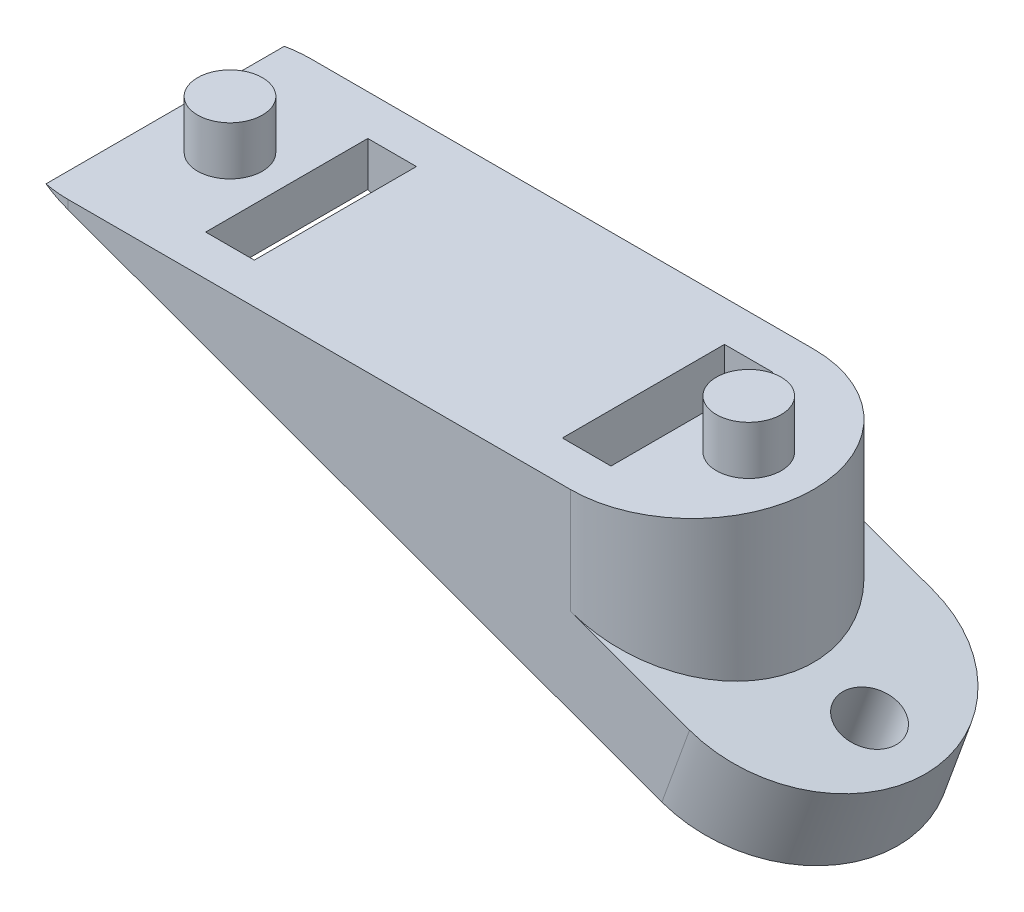
ISO-10303-21;
HEADER;
FILE_DESCRIPTION(('STEP AP214'),'2;1');
FILE_NAME('part.step','',(''),(''),'','','');
FILE_SCHEMA(('AUTOMOTIVE_DESIGN { 1 0 10303 214 1 1 1 1 }'));
ENDSEC;
DATA;
#1=APPLICATION_CONTEXT('core data for automotive mechanical design processes');
#2=APPLICATION_PROTOCOL_DEFINITION('international standard','automotive_design',2000,#1);
#3=PRODUCT_CONTEXT('',#1,'mechanical');
#4=PRODUCT('Part','Part','',(#3));
#5=PRODUCT_RELATED_PRODUCT_CATEGORY('part','',(#4));
#6=PRODUCT_DEFINITION_FORMATION('','',#4);
#7=PRODUCT_DEFINITION_CONTEXT('part definition',#1,'design');
#8=PRODUCT_DEFINITION('design','',#6,#7);
#9=PRODUCT_DEFINITION_SHAPE('','',#8);
#10=(LENGTH_UNIT() NAMED_UNIT(*) SI_UNIT(.MILLI.,.METRE.));
#11=(NAMED_UNIT(*) PLANE_ANGLE_UNIT() SI_UNIT($,.RADIAN.));
#12=(NAMED_UNIT(*) SI_UNIT($,.STERADIAN.) SOLID_ANGLE_UNIT());
#13=UNCERTAINTY_MEASURE_WITH_UNIT(LENGTH_MEASURE(1.E-05),#10,'distance_accuracy_value','');
#14=(GEOMETRIC_REPRESENTATION_CONTEXT(3) GLOBAL_UNCERTAINTY_ASSIGNED_CONTEXT((#13)) GLOBAL_UNIT_ASSIGNED_CONTEXT((#10,
#11,#12)) REPRESENTATION_CONTEXT('',''));
#15=CARTESIAN_POINT('',(0.,0.,0.));
#16=DIRECTION('',(0.,0.,1.));
#17=DIRECTION('',(1.,0.,0.));
#18=AXIS2_PLACEMENT_3D('',#15,#16,#17);
#19=CARTESIAN_POINT('',(-7.10574103466688,7.08184269547099,20.0504836688192));
#20=DIRECTION('',(0.342020143325672,0.939692620785907,0.));
#21=DIRECTION('',(-0.939692620785907,0.342020143325672,0.));
#22=AXIS2_PLACEMENT_3D('',#19,#20,#21);
#23=PLANE('',#22);
#24=CARTESIAN_POINT('',(35.5975196278801,-8.4608730918071,12.5504836688192));
#25=DIRECTION('',(0.342020143325672,0.939692620785907,0.));
#26=DIRECTION('',(-0.939692620785907,0.342020143325672,0.));
#27=AXIS2_PLACEMENT_3D('',#24,#25,#26);
#28=CIRCLE('',#27,1.75);
#29=CARTESIAN_POINT('',(33.9530575415047,-7.86233784098717,12.5504836688192));
#30=VERTEX_POINT('',#29);
#31=EDGE_CURVE('E237',#30,#30,#28,.T.);
#32=ORIENTED_EDGE('',*,*,#31,.F.);
#33=EDGE_LOOP('',(#32));
#34=FACE_BOUND('',#33,.T.);
#35=DIRECTION('',(0.939692620785907,-0.342020143325672,0.));
#36=VECTOR('',#35,1.);
#37=CARTESIAN_POINT('',(-7.10574103466687,7.08184269547099,5.05048366881919));
#38=LINE('',#37,#36);
#39=CARTESIAN_POINT('',(24.649544079261,-4.47613586663552,5.05048366881919));
#40=VERTEX_POINT('',#39);
#41=CARTESIAN_POINT('',(31.9978005206048,-7.15068248503959,5.0504836688192));
#42=VERTEX_POINT('',#41);
#43=EDGE_CURVE('E287',#40,#42,#38,.T.);
#44=ORIENTED_EDGE('',*,*,#43,.F.);
#45=CARTESIAN_POINT('',(24.649544079261,-4.47613586663552,12.5504836688192));
#46=DIRECTION('',(0.342020143325672,0.939692620785907,0.));
#47=DIRECTION('',(-0.939692620785907,0.342020143325672,0.));
#48=AXIS2_PLACEMENT_3D('',#45,#46,#47);
#49=ELLIPSE('',#48,7.98133329356935,7.5);
#50=CARTESIAN_POINT('',(24.649544079261,-4.47613586663552,20.0504836688192));
#51=VERTEX_POINT('',#50);
#52=EDGE_CURVE('E11',#51,#40,#49,.T.);
#53=ORIENTED_EDGE('',*,*,#52,.F.);
#54=DIRECTION('',(0.939692620785907,-0.342020143325672,0.));
#55=VECTOR('',#54,1.);
#56=CARTESIAN_POINT('',(-7.10574103466688,7.08184269547099,20.0504836688192));
#57=LINE('',#56,#55);
#58=CARTESIAN_POINT('',(31.9978005206048,-7.15068248503958,20.0504836688192));
#59=VERTEX_POINT('',#58);
#60=EDGE_CURVE('E53',#51,#59,#57,.T.);
#61=ORIENTED_EDGE('',*,*,#60,.T.);
#62=CARTESIAN_POINT('',(31.9978005206048,-7.15068248503958,12.5504836688192));
#63=DIRECTION('',(-0.342020143325673,-0.939692620785907,0.));
#64=DIRECTION('',(0.939692620785907,-0.342020143325673,0.));
#65=AXIS2_PLACEMENT_3D('',#62,#63,#64);
#66=CIRCLE('',#65,7.5);
#67=EDGE_CURVE('E291',#59,#42,#66,.F.);
#68=ORIENTED_EDGE('',*,*,#67,.T.);
#69=EDGE_LOOP('',(#44,#53,#61,#68));
#70=FACE_BOUND('',#69,.T.);
#71=ADVANCED_FACE('F43',(#34,#70),#23,.T.);
#72=CARTESIAN_POINT('',(-7.10574103466687,7.08184269547099,5.05048366881919));
#73=DIRECTION('',(0.,0.,1.));
#74=DIRECTION('',(1.,0.,0.));
#75=AXIS2_PLACEMENT_3D('',#72,#73,#74);
#76=PLANE('',#75);
#77=DIRECTION('',(-0.939692620785907,0.342020143325673,0.));
#78=VECTOR('',#77,1.);
#79=CARTESIAN_POINT('',(-0.265254147838327,-0.728779781602463,5.05048366881918));
#80=LINE('',#79,#78);
#81=CARTESIAN_POINT('',(30.2876998039764,-11.8491455889691,5.0504836688192));
#82=VERTEX_POINT('',#81);
#83=CARTESIAN_POINT('',(-6.35045592073901,1.48605253323734,5.05048366881919));
#84=VERTEX_POINT('',#83);
#85=EDGE_CURVE('E295',#82,#84,#80,.T.);
#86=ORIENTED_EDGE('',*,*,#85,.T.);
#87=DIRECTION('',(0.,1.,0.));
#88=VECTOR('',#87,1.);
#89=CARTESIAN_POINT('',(-6.35045592073901,-22.9679921153634,5.05048366881919));
#90=LINE('',#89,#88);
#91=CARTESIAN_POINT('',(-6.35045592073901,2.03200788463664,5.05048366881919));
#92=VERTEX_POINT('',#91);
#93=EDGE_CURVE('E248',#84,#92,#90,.T.);
#94=ORIENTED_EDGE('',*,*,#93,.T.);
#95=DIRECTION('',(1.,0.,0.));
#96=VECTOR('',#95,1.);
#97=CARTESIAN_POINT('',(-6.35045592073901,2.03200788463664,5.05048366881919));
#98=LINE('',#97,#96);
#99=CARTESIAN_POINT('',(24.649544079261,2.03200788463664,5.05048366881919));
#100=VERTEX_POINT('',#99);
#101=EDGE_CURVE('E251',#92,#100,#98,.T.);
#102=ORIENTED_EDGE('',*,*,#101,.T.);
#103=DIRECTION('',(0.,1.,0.));
#104=VECTOR('',#103,1.);
#105=CARTESIAN_POINT('',(24.649544079261,-22.9679921153634,5.05048366881919));
#106=LINE('',#105,#104);
#107=EDGE_CURVE('E250',#40,#100,#106,.T.);
#108=ORIENTED_EDGE('',*,*,#107,.F.);
#109=ORIENTED_EDGE('',*,*,#43,.T.);
#110=DIRECTION('',(-0.342020143325673,-0.939692620785907,0.));
#111=VECTOR('',#110,1.);
#112=CARTESIAN_POINT('',(31.9978005206048,-7.15068248503959,5.0504836688192));
#113=LINE('',#112,#111);
#114=EDGE_CURVE('E289',#42,#82,#113,.T.);
#115=ORIENTED_EDGE('',*,*,#114,.T.);
#116=EDGE_LOOP('',(#86,#94,#102,#108,#109,#115));
#117=FACE_BOUND('',#116,.T.);
#118=ADVANCED_FACE('F315',(#117),#76,.F.);
#119=CARTESIAN_POINT('',(-7.10574103466688,7.08184269547099,20.0504836688192));
#120=DIRECTION('',(0.,0.,1.));
#121=DIRECTION('',(1.,0.,0.));
#122=AXIS2_PLACEMENT_3D('',#119,#120,#121);
#123=PLANE('',#122);
#124=ORIENTED_EDGE('',*,*,#60,.F.);
#125=DIRECTION('',(0.,1.,0.));
#126=VECTOR('',#125,1.);
#127=CARTESIAN_POINT('',(24.649544079261,-22.9679921153634,20.0504836688192));
#128=LINE('',#127,#126);
#129=CARTESIAN_POINT('',(24.649544079261,2.03200788463664,20.0504836688192));
#130=VERTEX_POINT('',#129);
#131=EDGE_CURVE('E245',#51,#130,#128,.T.);
#132=ORIENTED_EDGE('',*,*,#131,.T.);
#133=DIRECTION('',(-1.,0.,0.));
#134=VECTOR('',#133,1.);
#135=CARTESIAN_POINT('',(24.649544079261,2.03200788463664,20.0504836688192));
#136=LINE('',#135,#134);
#137=CARTESIAN_POINT('',(-6.35045592073901,2.03200788463664,20.0504836688192));
#138=VERTEX_POINT('',#137);
#139=EDGE_CURVE('E262',#130,#138,#136,.T.);
#140=ORIENTED_EDGE('',*,*,#139,.T.);
#141=DIRECTION('',(0.,1.,0.));
#142=VECTOR('',#141,1.);
#143=CARTESIAN_POINT('',(-6.35045592073901,-22.9679921153634,20.0504836688192));
#144=LINE('',#143,#142);
#145=CARTESIAN_POINT('',(-6.35045592073901,1.48605253323734,20.0504836688192));
#146=VERTEX_POINT('',#145);
#147=EDGE_CURVE('E246',#146,#138,#144,.T.);
#148=ORIENTED_EDGE('',*,*,#147,.F.);
#149=DIRECTION('',(0.939692620785907,-0.342020143325673,0.));
#150=VECTOR('',#149,1.);
#151=CARTESIAN_POINT('',(-0.265254147838324,-0.728779781602463,20.0504836688192));
#152=LINE('',#151,#150);
#153=CARTESIAN_POINT('',(30.2876998039764,-11.8491455889691,20.0504836688192));
#154=VERTEX_POINT('',#153);
#155=EDGE_CURVE('E298',#146,#154,#152,.T.);
#156=ORIENTED_EDGE('',*,*,#155,.T.);
#157=DIRECTION('',(-0.342020143325673,-0.939692620785907,0.));
#158=VECTOR('',#157,1.);
#159=CARTESIAN_POINT('',(31.9978005206048,-7.15068248503958,20.0504836688192));
#160=LINE('',#159,#158);
#161=EDGE_CURVE('E294',#59,#154,#160,.T.);
#162=ORIENTED_EDGE('',*,*,#161,.F.);
#163=EDGE_LOOP('',(#124,#132,#140,#148,#156,#162));
#164=FACE_BOUND('',#163,.T.);
#165=ADVANCED_FACE('F319',(#164),#123,.T.);
#166=CARTESIAN_POINT('',(31.9978005206048,-7.15068248503958,12.5504836688192));
#167=DIRECTION('',(-0.342020143325673,-0.939692620785907,0.));
#168=DIRECTION('',(0.939692620785907,-0.342020143325673,0.));
#169=AXIS2_PLACEMENT_3D('',#166,#167,#168);
#170=CYLINDRICAL_SURFACE('',#169,7.5);
#171=CARTESIAN_POINT('',(30.2876998039764,-11.8491455889691,12.5504836688192));
#172=DIRECTION('',(-0.342020143325673,-0.939692620785907,0.));
#173=DIRECTION('',(0.939692620785907,-0.342020143325673,0.));
#174=AXIS2_PLACEMENT_3D('',#171,#172,#173);
#175=CIRCLE('',#174,7.5);
#176=EDGE_CURVE('E280',#154,#82,#175,.F.);
#177=ORIENTED_EDGE('',*,*,#176,.T.);
#178=ORIENTED_EDGE('',*,*,#114,.F.);
#179=ORIENTED_EDGE('',*,*,#67,.F.);
#180=ORIENTED_EDGE('',*,*,#161,.T.);
#181=EDGE_LOOP('',(#177,#178,#179,#180));
#182=FACE_BOUND('',#181,.T.);
#183=ADVANCED_FACE('F45',(#182),#170,.T.);
#184=CARTESIAN_POINT('',(-0.265254147838324,-0.728779781602464,0.));
#185=DIRECTION('',(-0.342020143325673,-0.939692620785907,0.));
#186=DIRECTION('',(0.939692620785907,-0.342020143325673,0.));
#187=AXIS2_PLACEMENT_3D('',#184,#185,#186);
#188=PLANE('',#187);
#189=DIRECTION('',(0.939692620785907,-0.342020143325673,0.));
#190=VECTOR('',#189,1.);
#191=CARTESIAN_POINT('',(5.86164435319822,-2.95878846435001,17.5504836688192));
#192=LINE('',#191,#190);
#193=CARTESIAN_POINT('',(-0.350455920738997,-0.697768872359909,17.5504836688192));
#194=VERTEX_POINT('',#193);
#195=CARTESIAN_POINT('',(2.649544079261,-1.78967957515853,17.5504836688192));
#196=VERTEX_POINT('',#195);
#197=EDGE_CURVE('E166',#194,#196,#192,.T.);
#198=ORIENTED_EDGE('',*,*,#197,.T.);
#199=DIRECTION('',(0.,0.,-1.));
#200=VECTOR('',#199,1.);
#201=CARTESIAN_POINT('',(2.649544079261,-1.78967957515853,7.55048366881919));
#202=LINE('',#201,#200);
#203=CARTESIAN_POINT('',(2.649544079261,-1.78967957515853,7.55048366881919));
#204=VERTEX_POINT('',#203);
#205=EDGE_CURVE('E153',#196,#204,#202,.T.);
#206=ORIENTED_EDGE('',*,*,#205,.T.);
#207=DIRECTION('',(-0.939692620785907,0.342020143325673,0.));
#208=VECTOR('',#207,1.);
#209=CARTESIAN_POINT('',(5.86164435319822,-2.95878846435001,7.55048366881919));
#210=LINE('',#209,#208);
#211=CARTESIAN_POINT('',(-0.350455920738998,-0.697768872359907,7.55048366881919));
#212=VERTEX_POINT('',#211);
#213=EDGE_CURVE('E185',#204,#212,#210,.T.);
#214=ORIENTED_EDGE('',*,*,#213,.T.);
#215=DIRECTION('',(0.,0.,1.));
#216=VECTOR('',#215,1.);
#217=CARTESIAN_POINT('',(-0.350455920738998,-0.697768872359908,7.55048366881919));
#218=LINE('',#217,#216);
#219=EDGE_CURVE('E174',#212,#194,#218,.T.);
#220=ORIENTED_EDGE('',*,*,#219,.T.);
#221=EDGE_LOOP('',(#198,#206,#214,#220));
#222=FACE_BOUND('',#221,.T.);
#223=DIRECTION('',(-0.939692620785907,0.342020143325673,0.));
#224=VECTOR('',#223,1.);
#225=CARTESIAN_POINT('',(27.9371998921854,-10.9936335854318,7.55048366881919));
#226=LINE('',#225,#224);
#227=CARTESIAN_POINT('',(24.649544079261,-9.79702472901509,7.55048366881919));
#228=VERTEX_POINT('',#227);
#229=CARTESIAN_POINT('',(21.649544079261,-8.70511402621647,7.55048366881919));
#230=VERTEX_POINT('',#229);
#231=EDGE_CURVE('E196',#228,#230,#226,.T.);
#232=ORIENTED_EDGE('',*,*,#231,.T.);
#233=DIRECTION('',(0.,0.,1.));
#234=VECTOR('',#233,1.);
#235=CARTESIAN_POINT('',(21.649544079261,-8.70511402621647,7.55048366881919));
#236=LINE('',#235,#234);
#237=CARTESIAN_POINT('',(21.649544079261,-8.70511402621647,17.5504836688192));
#238=VERTEX_POINT('',#237);
#239=EDGE_CURVE('E197',#230,#238,#236,.T.);
#240=ORIENTED_EDGE('',*,*,#239,.T.);
#241=DIRECTION('',(0.939692620785907,-0.342020143325673,0.));
#242=VECTOR('',#241,1.);
#243=CARTESIAN_POINT('',(27.9371998921854,-10.9936335854318,17.5504836688192));
#244=LINE('',#243,#242);
#245=CARTESIAN_POINT('',(24.649544079261,-9.79702472901508,17.5504836688192));
#246=VERTEX_POINT('',#245);
#247=EDGE_CURVE('E200',#238,#246,#244,.T.);
#248=ORIENTED_EDGE('',*,*,#247,.T.);
#249=DIRECTION('',(0.,0.,-1.));
#250=VECTOR('',#249,1.);
#251=CARTESIAN_POINT('',(24.649544079261,-9.79702472901509,7.55048366881919));
#252=LINE('',#251,#250);
#253=EDGE_CURVE('E193',#246,#228,#252,.T.);
#254=ORIENTED_EDGE('',*,*,#253,.T.);
#255=EDGE_LOOP('',(#232,#240,#248,#254));
#256=FACE_BOUND('',#255,.T.);
#257=CARTESIAN_POINT('',(12.1962504520687,-5.26439653014003,12.5504836688192));
#258=DIRECTION('',(-0.342020143325673,-0.939692620785907,0.));
#259=DIRECTION('',(0.939692620785907,-0.342020143325673,0.));
#260=AXIS2_PLACEMENT_3D('',#257,#258,#259);
#261=CIRCLE('',#260,2.5);
#262=CARTESIAN_POINT('',(14.5454820040334,-6.11944688845421,12.5504836688192));
#263=VERTEX_POINT('',#262);
#264=EDGE_CURVE('E222',#263,#263,#261,.T.);
#265=ORIENTED_EDGE('',*,*,#264,.F.);
#266=EDGE_LOOP('',(#265));
#267=FACE_BOUND('',#266,.T.);
#268=CARTESIAN_POINT('',(18.77409879757,-7.65853753341974,12.5504836688192));
#269=DIRECTION('',(-0.342020143325673,-0.939692620785907,0.));
#270=DIRECTION('',(0.939692620785907,-0.342020143325673,0.));
#271=AXIS2_PLACEMENT_3D('',#268,#269,#270);
#272=CIRCLE('',#271,2.5);
#273=CARTESIAN_POINT('',(21.1233303495348,-8.51358789173392,12.5504836688192));
#274=VERTEX_POINT('',#273);
#275=EDGE_CURVE('E228',#274,#274,#272,.T.);
#276=ORIENTED_EDGE('',*,*,#275,.F.);
#277=EDGE_LOOP('',(#276));
#278=FACE_BOUND('',#277,.T.);
#279=CARTESIAN_POINT('',(5.61840210656732,-2.87025552686032,12.5504836688192));
#280=DIRECTION('',(-0.342020143325673,-0.939692620785907,0.));
#281=DIRECTION('',(0.939692620785907,-0.342020143325673,0.));
#282=AXIS2_PLACEMENT_3D('',#279,#280,#281);
#283=CIRCLE('',#282,2.5);
#284=CARTESIAN_POINT('',(7.96763365853209,-3.7253058851745,12.5504836688192));
#285=VERTEX_POINT('',#284);
#286=EDGE_CURVE('E231',#285,#285,#283,.T.);
#287=ORIENTED_EDGE('',*,*,#286,.F.);
#288=EDGE_LOOP('',(#287));
#289=FACE_BOUND('',#288,.T.);
#290=CARTESIAN_POINT('',(33.8874189112517,-13.1593361957366,12.5504836688192));
#291=DIRECTION('',(-0.342020143325673,-0.939692620785907,0.));
#292=DIRECTION('',(0.939692620785907,-0.342020143325673,0.));
#293=AXIS2_PLACEMENT_3D('',#290,#291,#292);
#294=CIRCLE('',#293,1.75);
#295=CARTESIAN_POINT('',(35.531880997627,-13.7578714465566,12.5504836688192));
#296=VERTEX_POINT('',#295);
#297=EDGE_CURVE('E47',#296,#296,#294,.T.);
#298=ORIENTED_EDGE('',*,*,#297,.F.);
#299=EDGE_LOOP('',(#298));
#300=FACE_BOUND('',#299,.T.);
#301=ORIENTED_EDGE('',*,*,#176,.F.);
#302=ORIENTED_EDGE('',*,*,#155,.F.);
#303=CARTESIAN_POINT('',(-6.35045592073901,1.48605253323733,12.5504836688192));
#304=DIRECTION('',(-0.342020143325673,-0.939692620785907,0.));
#305=DIRECTION('',(-0.939692620785907,0.342020143325673,0.));
#306=AXIS2_PLACEMENT_3D('',#303,#304,#305);
#307=ELLIPSE('',#306,7.98133329356935,7.5);
#308=CARTESIAN_POINT('',(-7.850455920739,2.03200788463664,19.8989528971687));
#309=VERTEX_POINT('',#308);
#310=EDGE_CURVE('E268',#146,#309,#307,.T.);
#311=ORIENTED_EDGE('',*,*,#310,.T.);
#312=DIRECTION('',(0.,0.,-1.));
#313=VECTOR('',#312,1.);
#314=CARTESIAN_POINT('',(-7.850455920739,2.03200788463664,19.8989528971687));
#315=LINE('',#314,#313);
#316=CARTESIAN_POINT('',(-7.850455920739,2.03200788463664,5.20201444046966));
#317=VERTEX_POINT('',#316);
#318=EDGE_CURVE('E257',#309,#317,#315,.T.);
#319=ORIENTED_EDGE('',*,*,#318,.T.);
#320=CARTESIAN_POINT('',(-6.35045592073901,1.48605253323733,12.5504836688192));
#321=DIRECTION('',(-0.342020143325673,-0.939692620785907,0.));
#322=DIRECTION('',(-0.939692620785907,0.342020143325673,0.));
#323=AXIS2_PLACEMENT_3D('',#320,#321,#322);
#324=ELLIPSE('',#323,7.98133329356935,7.5);
#325=EDGE_CURVE('E270',#317,#84,#324,.T.);
#326=ORIENTED_EDGE('',*,*,#325,.T.);
#327=ORIENTED_EDGE('',*,*,#85,.F.);
#328=EDGE_LOOP('',(#301,#302,#311,#319,#326,#327));
#329=FACE_BOUND('',#328,.T.);
#330=ADVANCED_FACE('F172',(#222,#256,#267,#278,#289,#300,#329),#188,.T.);
#331=CARTESIAN_POINT('',(24.649544079261,-22.9679921153634,12.5504836688192));
#332=DIRECTION('',(0.,1.,0.));
#333=DIRECTION('',(0.,0.,1.));
#334=AXIS2_PLACEMENT_3D('',#331,#332,#333);
#335=CYLINDRICAL_SURFACE('',#334,7.5);
#336=ORIENTED_EDGE('',*,*,#52,.T.);
#337=ORIENTED_EDGE('',*,*,#107,.T.);
#338=CARTESIAN_POINT('',(24.649544079261,2.03200788463664,12.5504836688192));
#339=DIRECTION('',(0.,-1.,0.));
#340=DIRECTION('',(0.,0.,-1.));
#341=AXIS2_PLACEMENT_3D('',#338,#339,#340);
#342=CIRCLE('',#341,7.5);
#343=EDGE_CURVE('E265',#100,#130,#342,.T.);
#344=ORIENTED_EDGE('',*,*,#343,.T.);
#345=ORIENTED_EDGE('',*,*,#131,.F.);
#346=EDGE_LOOP('',(#336,#337,#344,#345));
#347=FACE_BOUND('',#346,.T.);
#348=ADVANCED_FACE('F322',(#347),#335,.T.);
#349=CARTESIAN_POINT('',(0.,5.03200788463664,0.));
#350=DIRECTION('',(0.,1.,0.));
#351=DIRECTION('',(0.,0.,1.));
#352=AXIS2_PLACEMENT_3D('',#349,#350,#351);
#353=PLANE('',#352);
#354=CARTESIAN_POINT('',(-3.85045592073901,5.03200788463664,12.5504836688192));
#355=DIRECTION('',(0.,1.,0.));
#356=DIRECTION('',(0.,0.,1.));
#357=AXIS2_PLACEMENT_3D('',#354,#355,#356);
#358=CIRCLE('',#357,2.);
#359=CARTESIAN_POINT('',(-3.85045592073901,5.03200788463664,14.5504836688192));
#360=VERTEX_POINT('',#359);
#361=EDGE_CURVE('E273',#360,#360,#358,.T.);
#362=ORIENTED_EDGE('',*,*,#361,.T.);
#363=EDGE_LOOP('',(#362));
#364=FACE_BOUND('',#363,.T.);
#365=ADVANCED_FACE('F354',(#364),#353,.T.);
#366=CARTESIAN_POINT('',(28.149544079261,5.03200788463664,12.5504836688192));
#367=DIRECTION('',(0.,-1.,0.));
#368=DIRECTION('',(0.,0.,-1.));
#369=AXIS2_PLACEMENT_3D('',#366,#367,#368);
#370=PLANE('',#369);
#371=CARTESIAN_POINT('',(28.149544079261,5.03200788463664,12.5504836688192));
#372=DIRECTION('',(0.,-1.,0.));
#373=DIRECTION('',(0.,0.,-1.));
#374=AXIS2_PLACEMENT_3D('',#371,#372,#373);
#375=CIRCLE('',#374,2.);
#376=CARTESIAN_POINT('',(28.149544079261,5.03200788463664,10.5504836688192));
#377=VERTEX_POINT('',#376);
#378=EDGE_CURVE('E277',#377,#377,#375,.T.);
#379=ORIENTED_EDGE('',*,*,#378,.F.);
#380=EDGE_LOOP('',(#379));
#381=FACE_BOUND('',#380,.T.);
#382=ADVANCED_FACE('F366',(#381),#370,.F.);
#383=CARTESIAN_POINT('',(-3.85045592073901,5.03200788463664,12.5504836688192));
#384=DIRECTION('',(0.,-1.,0.));
#385=DIRECTION('',(0.,0.,-1.));
#386=AXIS2_PLACEMENT_3D('',#383,#384,#385);
#387=CYLINDRICAL_SURFACE('',#386,2.);
#388=ORIENTED_EDGE('',*,*,#361,.F.);
#389=EDGE_LOOP('',(#388));
#390=FACE_BOUND('',#389,.T.);
#391=CARTESIAN_POINT('',(-3.85045592073901,2.03200788463664,12.5504836688192));
#392=DIRECTION('',(0.,-1.,0.));
#393=DIRECTION('',(0.,0.,-1.));
#394=AXIS2_PLACEMENT_3D('',#391,#392,#393);
#395=CIRCLE('',#394,2.);
#396=CARTESIAN_POINT('',(-3.85045592073901,2.03200788463664,10.5504836688192));
#397=VERTEX_POINT('',#396);
#398=EDGE_CURVE('E242',#397,#397,#395,.F.);
#399=ORIENTED_EDGE('',*,*,#398,.T.);
#400=EDGE_LOOP('',(#399));
#401=FACE_BOUND('',#400,.T.);
#402=ADVANCED_FACE('F345',(#390,#401),#387,.T.);
#403=CARTESIAN_POINT('',(28.149544079261,5.03200788463664,12.5504836688192));
#404=DIRECTION('',(0.,-1.,0.));
#405=DIRECTION('',(0.,0.,-1.));
#406=AXIS2_PLACEMENT_3D('',#403,#404,#405);
#407=CYLINDRICAL_SURFACE('',#406,2.);
#408=ORIENTED_EDGE('',*,*,#378,.T.);
#409=EDGE_LOOP('',(#408));
#410=FACE_BOUND('',#409,.T.);
#411=CARTESIAN_POINT('',(28.149544079261,2.03200788463664,12.5504836688192));
#412=DIRECTION('',(0.,-1.,0.));
#413=DIRECTION('',(0.,0.,-1.));
#414=AXIS2_PLACEMENT_3D('',#411,#412,#413);
#415=CIRCLE('',#414,2.);
#416=CARTESIAN_POINT('',(28.149544079261,2.03200788463664,10.5504836688192));
#417=VERTEX_POINT('',#416);
#418=EDGE_CURVE('E276',#417,#417,#415,.T.);
#419=ORIENTED_EDGE('',*,*,#418,.F.);
#420=EDGE_LOOP('',(#419));
#421=FACE_BOUND('',#420,.T.);
#422=ADVANCED_FACE('F336',(#410,#421),#407,.T.);
#423=CARTESIAN_POINT('',(-6.35045592073901,-22.9679921153634,12.5504836688192));
#424=DIRECTION('',(0.,1.,0.));
#425=DIRECTION('',(0.,0.,1.));
#426=AXIS2_PLACEMENT_3D('',#423,#424,#425);
#427=CYLINDRICAL_SURFACE('',#426,7.5);
#428=ORIENTED_EDGE('',*,*,#325,.F.);
#429=CARTESIAN_POINT('',(-6.35045592073901,2.03200788463664,12.5504836688192));
#430=DIRECTION('',(0.,-1.,0.));
#431=DIRECTION('',(0.,0.,-1.));
#432=AXIS2_PLACEMENT_3D('',#429,#430,#431);
#433=CIRCLE('',#432,7.5);
#434=EDGE_CURVE('E254',#317,#92,#433,.T.);
#435=ORIENTED_EDGE('',*,*,#434,.T.);
#436=ORIENTED_EDGE('',*,*,#93,.F.);
#437=EDGE_LOOP('',(#428,#435,#436));
#438=FACE_BOUND('',#437,.T.);
#439=ADVANCED_FACE('F334',(#438),#427,.T.);
#440=CARTESIAN_POINT('',(24.649544079261,2.03200788463664,12.5504836688192));
#441=DIRECTION('',(0.,-1.,0.));
#442=DIRECTION('',(0.,0.,-1.));
#443=AXIS2_PLACEMENT_3D('',#440,#441,#442);
#444=PLANE('',#443);
#445=DIRECTION('',(0.,0.,-1.));
#446=VECTOR('',#445,1.);
#447=CARTESIAN_POINT('',(2.649544079261,2.03200788463664,7.55048366881919));
#448=LINE('',#447,#446);
#449=CARTESIAN_POINT('',(2.649544079261,2.03200788463664,17.5504836688192));
#450=VERTEX_POINT('',#449);
#451=CARTESIAN_POINT('',(2.649544079261,2.03200788463664,7.55048366881919));
#452=VERTEX_POINT('',#451);
#453=EDGE_CURVE('E177',#450,#452,#448,.T.);
#454=ORIENTED_EDGE('',*,*,#453,.F.);
#455=DIRECTION('',(1.,0.,0.));
#456=VECTOR('',#455,1.);
#457=CARTESIAN_POINT('',(-0.350455920738997,2.03200788463664,17.5504836688192));
#458=LINE('',#457,#456);
#459=CARTESIAN_POINT('',(-0.350455920738997,2.03200788463664,17.5504836688192));
#460=VERTEX_POINT('',#459);
#461=EDGE_CURVE('E169',#460,#450,#458,.T.);
#462=ORIENTED_EDGE('',*,*,#461,.F.);
#463=DIRECTION('',(0.,0.,1.));
#464=VECTOR('',#463,1.);
#465=CARTESIAN_POINT('',(-0.350455920738998,2.03200788463664,7.55048366881919));
#466=LINE('',#465,#464);
#467=CARTESIAN_POINT('',(-0.350455920738999,2.03200788463664,7.55048366881919));
#468=VERTEX_POINT('',#467);
#469=EDGE_CURVE('E181',#468,#460,#466,.T.);
#470=ORIENTED_EDGE('',*,*,#469,.F.);
#471=DIRECTION('',(-1.,0.,0.));
#472=VECTOR('',#471,1.);
#473=CARTESIAN_POINT('',(-0.350455920738998,2.03200788463664,7.55048366881919));
#474=LINE('',#473,#472);
#475=EDGE_CURVE('E175',#452,#468,#474,.T.);
#476=ORIENTED_EDGE('',*,*,#475,.F.);
#477=EDGE_LOOP('',(#454,#462,#470,#476));
#478=FACE_BOUND('',#477,.T.);
#479=DIRECTION('',(0.,0.,1.));
#480=VECTOR('',#479,1.);
#481=CARTESIAN_POINT('',(21.649544079261,2.03200788463664,7.55048366881919));
#482=LINE('',#481,#480);
#483=CARTESIAN_POINT('',(21.649544079261,2.03200788463664,7.55048366881919));
#484=VERTEX_POINT('',#483);
#485=CARTESIAN_POINT('',(21.649544079261,2.03200788463664,17.5504836688192));
#486=VERTEX_POINT('',#485);
#487=EDGE_CURVE('E218',#484,#486,#482,.T.);
#488=ORIENTED_EDGE('',*,*,#487,.F.);
#489=DIRECTION('',(-1.,0.,0.));
#490=VECTOR('',#489,1.);
#491=CARTESIAN_POINT('',(24.649544079261,2.03200788463664,7.55048366881919));
#492=LINE('',#491,#490);
#493=CARTESIAN_POINT('',(24.649544079261,2.03200788463664,7.55048366881919));
#494=VERTEX_POINT('',#493);
#495=EDGE_CURVE('E215',#494,#484,#492,.T.);
#496=ORIENTED_EDGE('',*,*,#495,.F.);
#497=DIRECTION('',(0.,0.,-1.));
#498=VECTOR('',#497,1.);
#499=CARTESIAN_POINT('',(24.649544079261,2.03200788463664,7.55048366881919));
#500=LINE('',#499,#498);
#501=CARTESIAN_POINT('',(24.649544079261,2.03200788463664,17.5504836688192));
#502=VERTEX_POINT('',#501);
#503=EDGE_CURVE('E213',#502,#494,#500,.T.);
#504=ORIENTED_EDGE('',*,*,#503,.F.);
#505=DIRECTION('',(1.,0.,0.));
#506=VECTOR('',#505,1.);
#507=CARTESIAN_POINT('',(24.649544079261,2.03200788463664,17.5504836688192));
#508=LINE('',#507,#506);
#509=EDGE_CURVE('E212',#486,#502,#508,.T.);
#510=ORIENTED_EDGE('',*,*,#509,.F.);
#511=EDGE_LOOP('',(#488,#496,#504,#510));
#512=FACE_BOUND('',#511,.T.);
#513=ORIENTED_EDGE('',*,*,#418,.T.);
#514=EDGE_LOOP('',(#513));
#515=FACE_BOUND('',#514,.T.);
#516=ORIENTED_EDGE('',*,*,#398,.F.);
#517=EDGE_LOOP('',(#516));
#518=FACE_BOUND('',#517,.T.);
#519=ORIENTED_EDGE('',*,*,#343,.F.);
#520=ORIENTED_EDGE('',*,*,#101,.F.);
#521=ORIENTED_EDGE('',*,*,#434,.F.);
#522=ORIENTED_EDGE('',*,*,#318,.F.);
#523=CARTESIAN_POINT('',(-6.35045592073901,2.03200788463664,12.5504836688192));
#524=DIRECTION('',(0.,-1.,0.));
#525=DIRECTION('',(0.,0.,-1.));
#526=AXIS2_PLACEMENT_3D('',#523,#524,#525);
#527=CIRCLE('',#526,7.5);
#528=EDGE_CURVE('E259',#138,#309,#527,.T.);
#529=ORIENTED_EDGE('',*,*,#528,.F.);
#530=ORIENTED_EDGE('',*,*,#139,.F.);
#531=EDGE_LOOP('',(#519,#520,#521,#522,#529,#530));
#532=FACE_BOUND('',#531,.T.);
#533=ADVANCED_FACE('F326',(#478,#512,#515,#518,#532),#444,.F.);
#534=CARTESIAN_POINT('',(-6.35045592073901,-22.9679921153634,12.5504836688192));
#535=DIRECTION('',(0.,1.,0.));
#536=DIRECTION('',(0.,0.,1.));
#537=AXIS2_PLACEMENT_3D('',#534,#535,#536);
#538=CYLINDRICAL_SURFACE('',#537,7.5);
#539=ORIENTED_EDGE('',*,*,#310,.F.);
#540=ORIENTED_EDGE('',*,*,#147,.T.);
#541=ORIENTED_EDGE('',*,*,#528,.T.);
#542=EDGE_LOOP('',(#539,#540,#541));
#543=FACE_BOUND('',#542,.T.);
#544=ADVANCED_FACE('F332',(#543),#538,.T.);
#545=CARTESIAN_POINT('',(32.1773181946233,-17.8577992996662,12.5504836688192));
#546=DIRECTION('',(0.342020143325672,0.939692620785907,0.));
#547=DIRECTION('',(-0.939692620785907,0.342020143325672,0.));
#548=AXIS2_PLACEMENT_3D('',#545,#546,#547);
#549=CYLINDRICAL_SURFACE('',#548,1.75);
#550=ORIENTED_EDGE('',*,*,#297,.T.);
#551=EDGE_LOOP('',(#550));
#552=FACE_BOUND('',#551,.T.);
#553=ORIENTED_EDGE('',*,*,#31,.T.);
#554=EDGE_LOOP('',(#553));
#555=FACE_BOUND('',#554,.T.);
#556=ADVANCED_FACE('F356',(#552,#555),#549,.F.);
#557=CARTESIAN_POINT('',(4.5923416765903,-5.68933338921804,12.5504836688192));
#558=DIRECTION('',(0.342020143325673,0.939692620785907,0.));
#559=DIRECTION('',(-0.939692620785907,0.342020143325673,0.));
#560=AXIS2_PLACEMENT_3D('',#557,#558,#559);
#561=CYLINDRICAL_SURFACE('',#560,2.5);
#562=CARTESIAN_POINT('',(4.5923416765903,-5.68933338921804,12.5504836688192));
#563=DIRECTION('',(-0.342020143325673,-0.939692620785907,0.));
#564=DIRECTION('',(0.939692620785907,-0.342020143325673,0.));
#565=AXIS2_PLACEMENT_3D('',#562,#563,#564);
#566=CIRCLE('',#565,2.5);
#567=CARTESIAN_POINT('',(6.94157322855507,-6.54438374753222,12.5504836688192));
#568=VERTEX_POINT('',#567);
#569=EDGE_CURVE('E234',#568,#568,#566,.T.);
#570=ORIENTED_EDGE('',*,*,#569,.F.);
#571=EDGE_LOOP('',(#570));
#572=FACE_BOUND('',#571,.T.);
#573=ORIENTED_EDGE('',*,*,#286,.T.);
#574=EDGE_LOOP('',(#573));
#575=FACE_BOUND('',#574,.T.);
#576=ADVANCED_FACE('F480',(#572,#575),#561,.T.);
#577=CARTESIAN_POINT('',(-1.29131457781534,-3.54785764396018,0.));
#578=DIRECTION('',(-0.342020143325673,-0.939692620785907,0.));
#579=DIRECTION('',(0.939692620785907,-0.342020143325673,0.));
#580=AXIS2_PLACEMENT_3D('',#577,#578,#579);
#581=PLANE('',#580);
#582=ORIENTED_EDGE('',*,*,#569,.T.);
#583=EDGE_LOOP('',(#582));
#584=FACE_BOUND('',#583,.T.);
#585=ADVANCED_FACE('F489',(#584),#581,.T.);
#586=CARTESIAN_POINT('',(17.748038367593,-10.4776153957775,12.5504836688192));
#587=DIRECTION('',(0.342020143325673,0.939692620785907,0.));
#588=DIRECTION('',(-0.939692620785907,0.342020143325673,0.));
#589=AXIS2_PLACEMENT_3D('',#586,#587,#588);
#590=CYLINDRICAL_SURFACE('',#589,2.5);
#591=CARTESIAN_POINT('',(17.748038367593,-10.4776153957775,12.5504836688192));
#592=DIRECTION('',(-0.342020143325673,-0.939692620785907,0.));
#593=DIRECTION('',(0.939692620785907,-0.342020143325673,0.));
#594=AXIS2_PLACEMENT_3D('',#591,#592,#593);
#595=CIRCLE('',#594,2.5);
#596=CARTESIAN_POINT('',(20.0972699195578,-11.3326657540916,12.5504836688192));
#597=VERTEX_POINT('',#596);
#598=EDGE_CURVE('E225',#597,#597,#595,.T.);
#599=ORIENTED_EDGE('',*,*,#598,.F.);
#600=EDGE_LOOP('',(#599));
#601=FACE_BOUND('',#600,.T.);
#602=ORIENTED_EDGE('',*,*,#275,.T.);
#603=EDGE_LOOP('',(#602));
#604=FACE_BOUND('',#603,.T.);
#605=ADVANCED_FACE('F498',(#601,#604),#590,.T.);
#606=CARTESIAN_POINT('',(17.748038367593,-10.4776153957775,12.5504836688192));
#607=DIRECTION('',(-0.342020143325673,-0.939692620785907,0.));
#608=DIRECTION('',(0.939692620785907,-0.342020143325673,0.));
#609=AXIS2_PLACEMENT_3D('',#606,#607,#608);
#610=PLANE('',#609);
#611=ORIENTED_EDGE('',*,*,#598,.T.);
#612=EDGE_LOOP('',(#611));
#613=FACE_BOUND('',#612,.T.);
#614=ADVANCED_FACE('F507',(#613),#610,.T.);
#615=CARTESIAN_POINT('',(11.1701900220917,-8.08347439249775,12.5504836688192));
#616=DIRECTION('',(0.342020143325673,0.939692620785907,0.));
#617=DIRECTION('',(-0.939692620785907,0.342020143325673,0.));
#618=AXIS2_PLACEMENT_3D('',#615,#616,#617);
#619=CYLINDRICAL_SURFACE('',#618,2.5);
#620=CARTESIAN_POINT('',(11.1701900220917,-8.08347439249775,12.5504836688192));
#621=DIRECTION('',(-0.342020143325673,-0.939692620785907,0.));
#622=DIRECTION('',(0.939692620785907,-0.342020143325673,0.));
#623=AXIS2_PLACEMENT_3D('',#620,#621,#622);
#624=CIRCLE('',#623,2.5);
#625=CARTESIAN_POINT('',(13.5194215740564,-8.93852475081193,12.5504836688192));
#626=VERTEX_POINT('',#625);
#627=EDGE_CURVE('E191',#626,#626,#624,.T.);
#628=ORIENTED_EDGE('',*,*,#627,.F.);
#629=EDGE_LOOP('',(#628));
#630=FACE_BOUND('',#629,.T.);
#631=ORIENTED_EDGE('',*,*,#264,.T.);
#632=EDGE_LOOP('',(#631));
#633=FACE_BOUND('',#632,.T.);
#634=ADVANCED_FACE('F516',(#630,#633),#619,.T.);
#635=CARTESIAN_POINT('',(11.1701900220917,-8.08347439249775,12.5504836688192));
#636=DIRECTION('',(-0.342020143325673,-0.939692620785907,0.));
#637=DIRECTION('',(0.939692620785907,-0.342020143325673,0.));
#638=AXIS2_PLACEMENT_3D('',#635,#636,#637);
#639=PLANE('',#638);
#640=ORIENTED_EDGE('',*,*,#627,.T.);
#641=EDGE_LOOP('',(#640));
#642=FACE_BOUND('',#641,.T.);
#643=ADVANCED_FACE('F525',(#642),#639,.T.);
#644=CARTESIAN_POINT('',(24.649544079261,-20.0263936943802,7.55048366881919));
#645=DIRECTION('',(0.,0.,-1.));
#646=DIRECTION('',(-1.,0.,0.));
#647=AXIS2_PLACEMENT_3D('',#644,#645,#646);
#648=PLANE('',#647);
#649=DIRECTION('',(0.,1.,0.));
#650=VECTOR('',#649,1.);
#651=CARTESIAN_POINT('',(24.649544079261,-20.0263936943802,7.55048366881919));
#652=LINE('',#651,#650);
#653=EDGE_CURVE('E69',#228,#494,#652,.T.);
#654=ORIENTED_EDGE('',*,*,#653,.T.);
#655=ORIENTED_EDGE('',*,*,#495,.T.);
#656=DIRECTION('',(0.,1.,0.));
#657=VECTOR('',#656,1.);
#658=CARTESIAN_POINT('',(21.649544079261,-20.0263936943802,7.55048366881919));
#659=LINE('',#658,#657);
#660=EDGE_CURVE('E194',#230,#484,#659,.T.);
#661=ORIENTED_EDGE('',*,*,#660,.F.);
#662=ORIENTED_EDGE('',*,*,#231,.F.);
#663=EDGE_LOOP('',(#654,#655,#661,#662));
#664=FACE_BOUND('',#663,.T.);
#665=ADVANCED_FACE('F533',(#664),#648,.F.);
#666=CARTESIAN_POINT('',(21.649544079261,-20.0263936943802,7.55048366881919));
#667=DIRECTION('',(-1.,0.,0.));
#668=DIRECTION('',(0.,0.,1.));
#669=AXIS2_PLACEMENT_3D('',#666,#667,#668);
#670=PLANE('',#669);
#671=ORIENTED_EDGE('',*,*,#660,.T.);
#672=ORIENTED_EDGE('',*,*,#487,.T.);
#673=DIRECTION('',(0.,1.,0.));
#674=VECTOR('',#673,1.);
#675=CARTESIAN_POINT('',(21.649544079261,-20.0263936943802,17.5504836688192));
#676=LINE('',#675,#674);
#677=EDGE_CURVE('E198',#238,#486,#676,.T.);
#678=ORIENTED_EDGE('',*,*,#677,.F.);
#679=ORIENTED_EDGE('',*,*,#239,.F.);
#680=EDGE_LOOP('',(#671,#672,#678,#679));
#681=FACE_BOUND('',#680,.T.);
#682=ADVANCED_FACE('F542',(#681),#670,.F.);
#683=CARTESIAN_POINT('',(24.649544079261,-20.0263936943802,17.5504836688192));
#684=DIRECTION('',(0.,0.,1.));
#685=DIRECTION('',(1.,0.,0.));
#686=AXIS2_PLACEMENT_3D('',#683,#684,#685);
#687=PLANE('',#686);
#688=ORIENTED_EDGE('',*,*,#677,.T.);
#689=ORIENTED_EDGE('',*,*,#509,.T.);
#690=DIRECTION('',(0.,1.,0.));
#691=VECTOR('',#690,1.);
#692=CARTESIAN_POINT('',(24.649544079261,-20.0263936943802,17.5504836688192));
#693=LINE('',#692,#691);
#694=EDGE_CURVE('E201',#246,#502,#693,.T.);
#695=ORIENTED_EDGE('',*,*,#694,.F.);
#696=ORIENTED_EDGE('',*,*,#247,.F.);
#697=EDGE_LOOP('',(#688,#689,#695,#696));
#698=FACE_BOUND('',#697,.T.);
#699=ADVANCED_FACE('F551',(#698),#687,.F.);
#700=CARTESIAN_POINT('',(24.649544079261,-20.0263936943802,7.55048366881919));
#701=DIRECTION('',(1.,0.,0.));
#702=DIRECTION('',(0.,0.,-1.));
#703=AXIS2_PLACEMENT_3D('',#700,#701,#702);
#704=PLANE('',#703);
#705=ORIENTED_EDGE('',*,*,#694,.T.);
#706=ORIENTED_EDGE('',*,*,#503,.T.);
#707=ORIENTED_EDGE('',*,*,#653,.F.);
#708=ORIENTED_EDGE('',*,*,#253,.F.);
#709=EDGE_LOOP('',(#705,#706,#707,#708));
#710=FACE_BOUND('',#709,.T.);
#711=ADVANCED_FACE('F560',(#710),#704,.F.);
#712=CARTESIAN_POINT('',(-0.350455920738997,-20.0263936943802,17.5504836688192));
#713=DIRECTION('',(0.,0.,1.));
#714=DIRECTION('',(1.,0.,0.));
#715=AXIS2_PLACEMENT_3D('',#712,#713,#714);
#716=PLANE('',#715);
#717=DIRECTION('',(0.,1.,0.));
#718=VECTOR('',#717,1.);
#719=CARTESIAN_POINT('',(-0.350455920738997,-20.0263936943802,17.5504836688192));
#720=LINE('',#719,#718);
#721=EDGE_CURVE('E61',#194,#460,#720,.T.);
#722=ORIENTED_EDGE('',*,*,#721,.T.);
#723=ORIENTED_EDGE('',*,*,#461,.T.);
#724=DIRECTION('',(0.,1.,0.));
#725=VECTOR('',#724,1.);
#726=CARTESIAN_POINT('',(2.649544079261,-20.0263936943802,17.5504836688192));
#727=LINE('',#726,#725);
#728=EDGE_CURVE('E157',#196,#450,#727,.T.);
#729=ORIENTED_EDGE('',*,*,#728,.F.);
#730=ORIENTED_EDGE('',*,*,#197,.F.);
#731=EDGE_LOOP('',(#722,#723,#729,#730));
#732=FACE_BOUND('',#731,.T.);
#733=ADVANCED_FACE('F165',(#732),#716,.F.);
#734=CARTESIAN_POINT('',(2.649544079261,-20.0263936943802,7.55048366881919));
#735=DIRECTION('',(1.,0.,0.));
#736=DIRECTION('',(0.,0.,-1.));
#737=AXIS2_PLACEMENT_3D('',#734,#735,#736);
#738=PLANE('',#737);
#739=ORIENTED_EDGE('',*,*,#728,.T.);
#740=ORIENTED_EDGE('',*,*,#453,.T.);
#741=DIRECTION('',(0.,1.,0.));
#742=VECTOR('',#741,1.);
#743=CARTESIAN_POINT('',(2.649544079261,-20.0263936943802,7.55048366881919));
#744=LINE('',#743,#742);
#745=EDGE_CURVE('E159',#204,#452,#744,.T.);
#746=ORIENTED_EDGE('',*,*,#745,.F.);
#747=ORIENTED_EDGE('',*,*,#205,.F.);
#748=EDGE_LOOP('',(#739,#740,#746,#747));
#749=FACE_BOUND('',#748,.T.);
#750=ADVANCED_FACE('F155',(#749),#738,.F.);
#751=CARTESIAN_POINT('',(-0.350455920738998,-20.0263936943802,7.55048366881919));
#752=DIRECTION('',(0.,0.,-1.));
#753=DIRECTION('',(-1.,0.,0.));
#754=AXIS2_PLACEMENT_3D('',#751,#752,#753);
#755=PLANE('',#754);
#756=ORIENTED_EDGE('',*,*,#745,.T.);
#757=ORIENTED_EDGE('',*,*,#475,.T.);
#758=DIRECTION('',(0.,1.,0.));
#759=VECTOR('',#758,1.);
#760=CARTESIAN_POINT('',(-0.350455920738998,-20.0263936943802,7.55048366881919));
#761=LINE('',#760,#759);
#762=EDGE_CURVE('E184',#212,#468,#761,.T.);
#763=ORIENTED_EDGE('',*,*,#762,.F.);
#764=ORIENTED_EDGE('',*,*,#213,.F.);
#765=EDGE_LOOP('',(#756,#757,#763,#764));
#766=FACE_BOUND('',#765,.T.);
#767=ADVANCED_FACE('F583',(#766),#755,.F.);
#768=CARTESIAN_POINT('',(-0.350455920738998,-20.0263936943802,7.55048366881919));
#769=DIRECTION('',(-1.,0.,0.));
#770=DIRECTION('',(0.,0.,1.));
#771=AXIS2_PLACEMENT_3D('',#768,#769,#770);
#772=PLANE('',#771);
#773=ORIENTED_EDGE('',*,*,#762,.T.);
#774=ORIENTED_EDGE('',*,*,#469,.T.);
#775=ORIENTED_EDGE('',*,*,#721,.F.);
#776=ORIENTED_EDGE('',*,*,#219,.F.);
#777=EDGE_LOOP('',(#773,#774,#775,#776));
#778=FACE_BOUND('',#777,.T.);
#779=ADVANCED_FACE('F591',(#778),#772,.F.);
#780=CLOSED_SHELL('',(#71,#118,#165,#183,#330,#348,#365,#382,#402,#422,#439,#533,#544,#556,#576,
#585,#605,#614,#634,#643,#665,#682,#699,#711,#733,#750,#767,#779));
#781=MANIFOLD_SOLID_BREP('B2',#780);
#782=ADVANCED_BREP_SHAPE_REPRESENTATION('',(#18,#781),#14);
#783=SHAPE_DEFINITION_REPRESENTATION(#9,#782);
ENDSEC;
END-ISO-10303-21;
